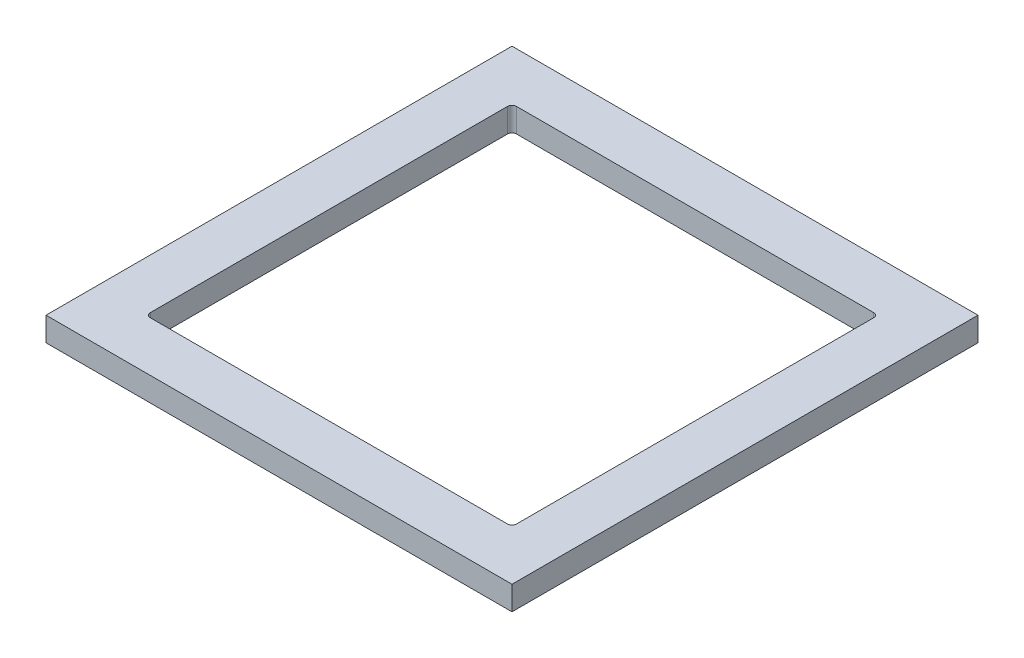
ISO-10303-21;
HEADER;
FILE_DESCRIPTION(('STEP AP214'),'2;1');
FILE_NAME('part.step','',(''),(''),'','','');
FILE_SCHEMA(('AUTOMOTIVE_DESIGN { 1 0 10303 214 1 1 1 1 }'));
ENDSEC;
DATA;
#1=APPLICATION_CONTEXT('core data for automotive mechanical design processes');
#2=APPLICATION_PROTOCOL_DEFINITION('international standard','automotive_design',2000,#1);
#3=PRODUCT_CONTEXT('',#1,'mechanical');
#4=PRODUCT('Part','Part','',(#3));
#5=PRODUCT_RELATED_PRODUCT_CATEGORY('part','',(#4));
#6=PRODUCT_DEFINITION_FORMATION('','',#4);
#7=PRODUCT_DEFINITION_CONTEXT('part definition',#1,'design');
#8=PRODUCT_DEFINITION('design','',#6,#7);
#9=PRODUCT_DEFINITION_SHAPE('','',#8);
#10=(LENGTH_UNIT() NAMED_UNIT(*) SI_UNIT(.MILLI.,.METRE.));
#11=(NAMED_UNIT(*) PLANE_ANGLE_UNIT() SI_UNIT($,.RADIAN.));
#12=(NAMED_UNIT(*) SI_UNIT($,.STERADIAN.) SOLID_ANGLE_UNIT());
#13=UNCERTAINTY_MEASURE_WITH_UNIT(LENGTH_MEASURE(1.E-05),#10,'distance_accuracy_value','');
#14=(GEOMETRIC_REPRESENTATION_CONTEXT(3) GLOBAL_UNCERTAINTY_ASSIGNED_CONTEXT((#13)) GLOBAL_UNIT_ASSIGNED_CONTEXT((#10,
#11,#12)) REPRESENTATION_CONTEXT('',''));
#15=CARTESIAN_POINT('',(0.,0.,0.));
#16=DIRECTION('',(0.,0.,1.));
#17=DIRECTION('',(1.,0.,0.));
#18=AXIS2_PLACEMENT_3D('',#15,#16,#17);
#19=CARTESIAN_POINT('',(177.8,18.25625,-177.8));
#20=DIRECTION('',(-1.,0.,0.));
#21=DIRECTION('',(0.,0.,1.));
#22=AXIS2_PLACEMENT_3D('',#19,#20,#21);
#23=PLANE('',#22);
#24=DIRECTION('',(0.,0.,-1.));
#25=VECTOR('',#24,1.);
#26=CARTESIAN_POINT('',(177.8,0.,-177.8));
#27=LINE('',#26,#25);
#28=CARTESIAN_POINT('',(177.8,0.,177.8));
#29=VERTEX_POINT('',#28);
#30=CARTESIAN_POINT('',(177.8,0.,-177.8));
#31=VERTEX_POINT('',#30);
#32=EDGE_CURVE('E146',#29,#31,#27,.T.);
#33=ORIENTED_EDGE('',*,*,#32,.T.);
#34=DIRECTION('',(0.,-1.,0.));
#35=VECTOR('',#34,1.);
#36=CARTESIAN_POINT('',(177.8,18.25625,-177.8));
#37=LINE('',#36,#35);
#38=CARTESIAN_POINT('',(177.8,18.25625,-177.8));
#39=VERTEX_POINT('',#38);
#40=EDGE_CURVE('E127',#39,#31,#37,.T.);
#41=ORIENTED_EDGE('',*,*,#40,.F.);
#42=DIRECTION('',(0.,0.,-1.));
#43=VECTOR('',#42,1.);
#44=CARTESIAN_POINT('',(177.8,18.25625,-177.8));
#45=LINE('',#44,#43);
#46=CARTESIAN_POINT('',(177.8,18.25625,177.8));
#47=VERTEX_POINT('',#46);
#48=EDGE_CURVE('E134',#47,#39,#45,.T.);
#49=ORIENTED_EDGE('',*,*,#48,.F.);
#50=DIRECTION('',(0.,-1.,0.));
#51=VECTOR('',#50,1.);
#52=CARTESIAN_POINT('',(177.8,18.25625,177.8));
#53=LINE('',#52,#51);
#54=EDGE_CURVE('E220',#47,#29,#53,.T.);
#55=ORIENTED_EDGE('',*,*,#54,.T.);
#56=EDGE_LOOP('',(#33,#41,#49,#55));
#57=FACE_BOUND('',#56,.T.);
#58=ADVANCED_FACE('F33',(#57),#23,.F.);
#59=CARTESIAN_POINT('',(-177.8,18.25625,-177.8));
#60=DIRECTION('',(0.,0.,1.));
#61=DIRECTION('',(1.,0.,0.));
#62=AXIS2_PLACEMENT_3D('',#59,#60,#61);
#63=PLANE('',#62);
#64=DIRECTION('',(-1.,0.,0.));
#65=VECTOR('',#64,1.);
#66=CARTESIAN_POINT('',(-177.8,0.,-177.8));
#67=LINE('',#66,#65);
#68=CARTESIAN_POINT('',(-177.8,0.,-177.8));
#69=VERTEX_POINT('',#68);
#70=EDGE_CURVE('E222',#31,#69,#67,.T.);
#71=ORIENTED_EDGE('',*,*,#70,.T.);
#72=DIRECTION('',(0.,-1.,0.));
#73=VECTOR('',#72,1.);
#74=CARTESIAN_POINT('',(-177.8,18.25625,-177.8));
#75=LINE('',#74,#73);
#76=CARTESIAN_POINT('',(-177.8,18.25625,-177.8));
#77=VERTEX_POINT('',#76);
#78=EDGE_CURVE('E130',#77,#69,#75,.T.);
#79=ORIENTED_EDGE('',*,*,#78,.F.);
#80=DIRECTION('',(-1.,0.,0.));
#81=VECTOR('',#80,1.);
#82=CARTESIAN_POINT('',(-177.8,18.25625,-177.8));
#83=LINE('',#82,#81);
#84=EDGE_CURVE('E123',#39,#77,#83,.T.);
#85=ORIENTED_EDGE('',*,*,#84,.F.);
#86=ORIENTED_EDGE('',*,*,#40,.T.);
#87=EDGE_LOOP('',(#71,#79,#85,#86));
#88=FACE_BOUND('',#87,.T.);
#89=ADVANCED_FACE('F125',(#88),#63,.F.);
#90=CARTESIAN_POINT('',(-177.8,18.25625,-177.8));
#91=DIRECTION('',(1.,0.,0.));
#92=DIRECTION('',(0.,0.,-1.));
#93=AXIS2_PLACEMENT_3D('',#90,#91,#92);
#94=PLANE('',#93);
#95=DIRECTION('',(0.,0.,1.));
#96=VECTOR('',#95,1.);
#97=CARTESIAN_POINT('',(-177.8,0.,-177.8));
#98=LINE('',#97,#96);
#99=CARTESIAN_POINT('',(-177.8,0.,177.8));
#100=VERTEX_POINT('',#99);
#101=EDGE_CURVE('E224',#69,#100,#98,.T.);
#102=ORIENTED_EDGE('',*,*,#101,.T.);
#103=DIRECTION('',(0.,-1.,0.));
#104=VECTOR('',#103,1.);
#105=CARTESIAN_POINT('',(-177.8,18.25625,177.8));
#106=LINE('',#105,#104);
#107=CARTESIAN_POINT('',(-177.8,18.25625,177.8));
#108=VERTEX_POINT('',#107);
#109=EDGE_CURVE('E151',#108,#100,#106,.T.);
#110=ORIENTED_EDGE('',*,*,#109,.F.);
#111=DIRECTION('',(0.,0.,1.));
#112=VECTOR('',#111,1.);
#113=CARTESIAN_POINT('',(-177.8,18.25625,-177.8));
#114=LINE('',#113,#112);
#115=EDGE_CURVE('E133',#77,#108,#114,.T.);
#116=ORIENTED_EDGE('',*,*,#115,.F.);
#117=ORIENTED_EDGE('',*,*,#78,.T.);
#118=EDGE_LOOP('',(#102,#110,#116,#117));
#119=FACE_BOUND('',#118,.T.);
#120=ADVANCED_FACE('F234',(#119),#94,.F.);
#121=CARTESIAN_POINT('',(-177.8,18.25625,177.8));
#122=DIRECTION('',(0.,0.,-1.));
#123=DIRECTION('',(-1.,0.,0.));
#124=AXIS2_PLACEMENT_3D('',#121,#122,#123);
#125=PLANE('',#124);
#126=DIRECTION('',(1.,0.,0.));
#127=VECTOR('',#126,1.);
#128=CARTESIAN_POINT('',(-177.8,0.,177.8));
#129=LINE('',#128,#127);
#130=EDGE_CURVE('E143',#100,#29,#129,.T.);
#131=ORIENTED_EDGE('',*,*,#130,.T.);
#132=ORIENTED_EDGE('',*,*,#54,.F.);
#133=DIRECTION('',(1.,0.,0.));
#134=VECTOR('',#133,1.);
#135=CARTESIAN_POINT('',(-177.8,18.25625,177.8));
#136=LINE('',#135,#134);
#137=EDGE_CURVE('E139',#108,#47,#136,.T.);
#138=ORIENTED_EDGE('',*,*,#137,.F.);
#139=ORIENTED_EDGE('',*,*,#109,.T.);
#140=EDGE_LOOP('',(#131,#132,#138,#139));
#141=FACE_BOUND('',#140,.T.);
#142=ADVANCED_FACE('F231',(#141),#125,.F.);
#143=CARTESIAN_POINT('',(0.,18.25625,0.));
#144=DIRECTION('',(0.,1.,0.));
#145=DIRECTION('',(0.,0.,1.));
#146=AXIS2_PLACEMENT_3D('',#143,#144,#145);
#147=PLANE('',#146);
#148=DIRECTION('',(0.,0.,1.));
#149=VECTOR('',#148,1.);
#150=CARTESIAN_POINT('',(-139.7,18.25625,-139.7));
#151=LINE('',#150,#149);
#152=CARTESIAN_POINT('',(-139.7,18.25625,-136.3218));
#153=VERTEX_POINT('',#152);
#154=CARTESIAN_POINT('',(-139.7,18.25625,136.3218));
#155=VERTEX_POINT('',#154);
#156=EDGE_CURVE('E184',#153,#155,#151,.T.);
#157=ORIENTED_EDGE('',*,*,#156,.F.);
#158=CARTESIAN_POINT('',(-136.3218,18.25625,-136.3218));
#159=DIRECTION('',(0.,1.,0.));
#160=DIRECTION('',(0.,0.,1.));
#161=AXIS2_PLACEMENT_3D('',#158,#159,#160);
#162=CIRCLE('',#161,3.3782);
#163=CARTESIAN_POINT('',(-136.3218,18.25625,-139.7));
#164=VERTEX_POINT('',#163);
#165=EDGE_CURVE('E179',#153,#164,#162,.F.);
#166=ORIENTED_EDGE('',*,*,#165,.T.);
#167=DIRECTION('',(-1.,0.,0.));
#168=VECTOR('',#167,1.);
#169=CARTESIAN_POINT('',(139.7,18.25625,-139.7));
#170=LINE('',#169,#168);
#171=CARTESIAN_POINT('',(136.3218,18.25625,-139.7));
#172=VERTEX_POINT('',#171);
#173=EDGE_CURVE('E208',#172,#164,#170,.T.);
#174=ORIENTED_EDGE('',*,*,#173,.F.);
#175=CARTESIAN_POINT('',(136.3218,18.25625,-136.3218));
#176=DIRECTION('',(0.,1.,0.));
#177=DIRECTION('',(0.,0.,1.));
#178=AXIS2_PLACEMENT_3D('',#175,#176,#177);
#179=CIRCLE('',#178,3.3782);
#180=CARTESIAN_POINT('',(139.7,18.25625,-136.3218));
#181=VERTEX_POINT('',#180);
#182=EDGE_CURVE('E171',#172,#181,#179,.F.);
#183=ORIENTED_EDGE('',*,*,#182,.T.);
#184=DIRECTION('',(0.,0.,-1.));
#185=VECTOR('',#184,1.);
#186=CARTESIAN_POINT('',(139.7,18.25625,-139.7));
#187=LINE('',#186,#185);
#188=CARTESIAN_POINT('',(139.7,18.25625,136.3218));
#189=VERTEX_POINT('',#188);
#190=EDGE_CURVE('E213',#189,#181,#187,.T.);
#191=ORIENTED_EDGE('',*,*,#190,.F.);
#192=CARTESIAN_POINT('',(136.3218,18.25625,136.3218));
#193=DIRECTION('',(0.,1.,0.));
#194=DIRECTION('',(0.,0.,1.));
#195=AXIS2_PLACEMENT_3D('',#192,#193,#194);
#196=CIRCLE('',#195,3.3782);
#197=CARTESIAN_POINT('',(136.3218,18.25625,139.7));
#198=VERTEX_POINT('',#197);
#199=EDGE_CURVE('E175',#189,#198,#196,.F.);
#200=ORIENTED_EDGE('',*,*,#199,.T.);
#201=DIRECTION('',(1.,0.,0.));
#202=VECTOR('',#201,1.);
#203=CARTESIAN_POINT('',(139.7,18.25625,139.7));
#204=LINE('',#203,#202);
#205=CARTESIAN_POINT('',(-136.3218,18.25625,139.7));
#206=VERTEX_POINT('',#205);
#207=EDGE_CURVE('E186',#206,#198,#204,.T.);
#208=ORIENTED_EDGE('',*,*,#207,.F.);
#209=CARTESIAN_POINT('',(-136.3218,18.25625,136.3218));
#210=DIRECTION('',(0.,1.,0.));
#211=DIRECTION('',(0.,0.,1.));
#212=AXIS2_PLACEMENT_3D('',#209,#210,#211);
#213=CIRCLE('',#212,3.3782);
#214=EDGE_CURVE('E41',#206,#155,#213,.F.);
#215=ORIENTED_EDGE('',*,*,#214,.T.);
#216=EDGE_LOOP('',(#157,#166,#174,#183,#191,#200,#208,#215));
#217=FACE_BOUND('',#216,.T.);
#218=ORIENTED_EDGE('',*,*,#48,.T.);
#219=ORIENTED_EDGE('',*,*,#84,.T.);
#220=ORIENTED_EDGE('',*,*,#115,.T.);
#221=ORIENTED_EDGE('',*,*,#137,.T.);
#222=EDGE_LOOP('',(#218,#219,#220,#221));
#223=FACE_BOUND('',#222,.T.);
#224=ADVANCED_FACE('F137',(#217,#223),#147,.T.);
#225=CARTESIAN_POINT('',(0.,0.,0.));
#226=DIRECTION('',(0.,1.,0.));
#227=DIRECTION('',(0.,0.,1.));
#228=AXIS2_PLACEMENT_3D('',#225,#226,#227);
#229=PLANE('',#228);
#230=DIRECTION('',(0.,0.,-1.));
#231=VECTOR('',#230,1.);
#232=CARTESIAN_POINT('',(139.7,0.,-139.7));
#233=LINE('',#232,#231);
#234=CARTESIAN_POINT('',(139.7,0.,136.3218));
#235=VERTEX_POINT('',#234);
#236=CARTESIAN_POINT('',(139.7,0.,-136.3218));
#237=VERTEX_POINT('',#236);
#238=EDGE_CURVE('E204',#235,#237,#233,.T.);
#239=ORIENTED_EDGE('',*,*,#238,.T.);
#240=CARTESIAN_POINT('',(136.3218,0.,-136.3218));
#241=DIRECTION('',(0.,1.,0.));
#242=DIRECTION('',(0.,0.,1.));
#243=AXIS2_PLACEMENT_3D('',#240,#241,#242);
#244=CIRCLE('',#243,3.3782);
#245=CARTESIAN_POINT('',(136.3218,0.,-139.7));
#246=VERTEX_POINT('',#245);
#247=EDGE_CURVE('E173',#237,#246,#244,.T.);
#248=ORIENTED_EDGE('',*,*,#247,.T.);
#249=DIRECTION('',(-1.,0.,0.));
#250=VECTOR('',#249,1.);
#251=CARTESIAN_POINT('',(139.7,0.,-139.7));
#252=LINE('',#251,#250);
#253=CARTESIAN_POINT('',(-136.3218,0.,-139.7));
#254=VERTEX_POINT('',#253);
#255=EDGE_CURVE('E206',#246,#254,#252,.T.);
#256=ORIENTED_EDGE('',*,*,#255,.T.);
#257=CARTESIAN_POINT('',(-136.3218,0.,-136.3218));
#258=DIRECTION('',(0.,1.,0.));
#259=DIRECTION('',(0.,0.,1.));
#260=AXIS2_PLACEMENT_3D('',#257,#258,#259);
#261=CIRCLE('',#260,3.3782);
#262=CARTESIAN_POINT('',(-139.7,0.,-136.3218));
#263=VERTEX_POINT('',#262);
#264=EDGE_CURVE('E55',#254,#263,#261,.T.);
#265=ORIENTED_EDGE('',*,*,#264,.T.);
#266=DIRECTION('',(0.,0.,1.));
#267=VECTOR('',#266,1.);
#268=CARTESIAN_POINT('',(-139.7,0.,-139.7));
#269=LINE('',#268,#267);
#270=CARTESIAN_POINT('',(-139.7,0.,136.3218));
#271=VERTEX_POINT('',#270);
#272=EDGE_CURVE('E200',#263,#271,#269,.T.);
#273=ORIENTED_EDGE('',*,*,#272,.T.);
#274=CARTESIAN_POINT('',(-136.3218,0.,136.3218));
#275=DIRECTION('',(0.,1.,0.));
#276=DIRECTION('',(0.,0.,1.));
#277=AXIS2_PLACEMENT_3D('',#274,#275,#276);
#278=CIRCLE('',#277,3.3782);
#279=CARTESIAN_POINT('',(-136.3218,0.,139.7));
#280=VERTEX_POINT('',#279);
#281=EDGE_CURVE('E11',#271,#280,#278,.T.);
#282=ORIENTED_EDGE('',*,*,#281,.T.);
#283=DIRECTION('',(1.,0.,0.));
#284=VECTOR('',#283,1.);
#285=CARTESIAN_POINT('',(139.7,0.,139.7));
#286=LINE('',#285,#284);
#287=CARTESIAN_POINT('',(136.3218,0.,139.7));
#288=VERTEX_POINT('',#287);
#289=EDGE_CURVE('E198',#280,#288,#286,.T.);
#290=ORIENTED_EDGE('',*,*,#289,.T.);
#291=CARTESIAN_POINT('',(136.3218,0.,136.3218));
#292=DIRECTION('',(0.,1.,0.));
#293=DIRECTION('',(0.,0.,1.));
#294=AXIS2_PLACEMENT_3D('',#291,#292,#293);
#295=CIRCLE('',#294,3.3782);
#296=EDGE_CURVE('E177',#288,#235,#295,.T.);
#297=ORIENTED_EDGE('',*,*,#296,.T.);
#298=EDGE_LOOP('',(#239,#248,#256,#265,#273,#282,#290,#297));
#299=FACE_BOUND('',#298,.T.);
#300=ORIENTED_EDGE('',*,*,#32,.F.);
#301=ORIENTED_EDGE('',*,*,#130,.F.);
#302=ORIENTED_EDGE('',*,*,#101,.F.);
#303=ORIENTED_EDGE('',*,*,#70,.F.);
#304=EDGE_LOOP('',(#300,#301,#302,#303));
#305=FACE_BOUND('',#304,.T.);
#306=ADVANCED_FACE('F196',(#299,#305),#229,.F.);
#307=CARTESIAN_POINT('',(-139.7,0.,-139.7));
#308=DIRECTION('',(-1.,0.,0.));
#309=DIRECTION('',(0.,0.,1.));
#310=AXIS2_PLACEMENT_3D('',#307,#308,#309);
#311=PLANE('',#310);
#312=ORIENTED_EDGE('',*,*,#272,.F.);
#313=DIRECTION('',(0.,1.,0.));
#314=VECTOR('',#313,1.);
#315=CARTESIAN_POINT('',(-139.7,18.25625,-136.3218));
#316=LINE('',#315,#314);
#317=EDGE_CURVE('E168',#263,#153,#316,.T.);
#318=ORIENTED_EDGE('',*,*,#317,.T.);
#319=ORIENTED_EDGE('',*,*,#156,.T.);
#320=DIRECTION('',(0.,1.,0.));
#321=VECTOR('',#320,1.);
#322=CARTESIAN_POINT('',(-139.7,0.,136.3218));
#323=LINE('',#322,#321);
#324=EDGE_CURVE('E48',#155,#271,#323,.F.);
#325=ORIENTED_EDGE('',*,*,#324,.T.);
#326=EDGE_LOOP('',(#312,#318,#319,#325));
#327=FACE_BOUND('',#326,.T.);
#328=ADVANCED_FACE('F189',(#327),#311,.F.);
#329=CARTESIAN_POINT('',(139.7,0.,-139.7));
#330=DIRECTION('',(0.,0.,-1.));
#331=DIRECTION('',(-1.,0.,0.));
#332=AXIS2_PLACEMENT_3D('',#329,#330,#331);
#333=PLANE('',#332);
#334=ORIENTED_EDGE('',*,*,#255,.F.);
#335=DIRECTION('',(0.,1.,0.));
#336=VECTOR('',#335,1.);
#337=CARTESIAN_POINT('',(136.3218,18.25625,-139.7));
#338=LINE('',#337,#336);
#339=EDGE_CURVE('E149',#246,#172,#338,.T.);
#340=ORIENTED_EDGE('',*,*,#339,.T.);
#341=ORIENTED_EDGE('',*,*,#173,.T.);
#342=DIRECTION('',(0.,1.,0.));
#343=VECTOR('',#342,1.);
#344=CARTESIAN_POINT('',(-136.3218,0.,-139.7));
#345=LINE('',#344,#343);
#346=EDGE_CURVE('E147',#164,#254,#345,.F.);
#347=ORIENTED_EDGE('',*,*,#346,.T.);
#348=EDGE_LOOP('',(#334,#340,#341,#347));
#349=FACE_BOUND('',#348,.T.);
#350=ADVANCED_FACE('F265',(#349),#333,.F.);
#351=CARTESIAN_POINT('',(139.7,0.,-139.7));
#352=DIRECTION('',(1.,0.,0.));
#353=DIRECTION('',(0.,0.,-1.));
#354=AXIS2_PLACEMENT_3D('',#351,#352,#353);
#355=PLANE('',#354);
#356=ORIENTED_EDGE('',*,*,#190,.T.);
#357=DIRECTION('',(0.,1.,0.));
#358=VECTOR('',#357,1.);
#359=CARTESIAN_POINT('',(139.7,0.,-136.3218));
#360=LINE('',#359,#358);
#361=EDGE_CURVE('E160',#181,#237,#360,.F.);
#362=ORIENTED_EDGE('',*,*,#361,.T.);
#363=ORIENTED_EDGE('',*,*,#238,.F.);
#364=DIRECTION('',(0.,1.,0.));
#365=VECTOR('',#364,1.);
#366=CARTESIAN_POINT('',(139.7,18.25625,136.3218));
#367=LINE('',#366,#365);
#368=EDGE_CURVE('E157',#235,#189,#367,.T.);
#369=ORIENTED_EDGE('',*,*,#368,.T.);
#370=EDGE_LOOP('',(#356,#362,#363,#369));
#371=FACE_BOUND('',#370,.T.);
#372=ADVANCED_FACE('F271',(#371),#355,.F.);
#373=CARTESIAN_POINT('',(139.7,0.,139.7));
#374=DIRECTION('',(0.,0.,1.));
#375=DIRECTION('',(1.,0.,0.));
#376=AXIS2_PLACEMENT_3D('',#373,#374,#375);
#377=PLANE('',#376);
#378=ORIENTED_EDGE('',*,*,#207,.T.);
#379=DIRECTION('',(0.,1.,0.));
#380=VECTOR('',#379,1.);
#381=CARTESIAN_POINT('',(136.3218,0.,139.7));
#382=LINE('',#381,#380);
#383=EDGE_CURVE('E165',#198,#288,#382,.F.);
#384=ORIENTED_EDGE('',*,*,#383,.T.);
#385=ORIENTED_EDGE('',*,*,#289,.F.);
#386=DIRECTION('',(0.,1.,0.));
#387=VECTOR('',#386,1.);
#388=CARTESIAN_POINT('',(-136.3218,18.25625,139.7));
#389=LINE('',#388,#387);
#390=EDGE_CURVE('E162',#280,#206,#389,.T.);
#391=ORIENTED_EDGE('',*,*,#390,.T.);
#392=EDGE_LOOP('',(#378,#384,#385,#391));
#393=FACE_BOUND('',#392,.T.);
#394=ADVANCED_FACE('F202',(#393),#377,.F.);
#395=CARTESIAN_POINT('',(136.3218,0.,-136.3218));
#396=DIRECTION('',(0.,-1.,0.));
#397=DIRECTION('',(0.,0.,-1.));
#398=AXIS2_PLACEMENT_3D('',#395,#396,#397);
#399=CYLINDRICAL_SURFACE('',#398,3.3782);
#400=ORIENTED_EDGE('',*,*,#247,.F.);
#401=ORIENTED_EDGE('',*,*,#361,.F.);
#402=ORIENTED_EDGE('',*,*,#182,.F.);
#403=ORIENTED_EDGE('',*,*,#339,.F.);
#404=EDGE_LOOP('',(#400,#401,#402,#403));
#405=FACE_BOUND('',#404,.T.);
#406=ADVANCED_FACE('F248',(#405),#399,.F.);
#407=CARTESIAN_POINT('',(136.3218,0.,136.3218));
#408=DIRECTION('',(0.,-1.,0.));
#409=DIRECTION('',(0.,0.,-1.));
#410=AXIS2_PLACEMENT_3D('',#407,#408,#409);
#411=CYLINDRICAL_SURFACE('',#410,3.3782);
#412=ORIENTED_EDGE('',*,*,#296,.F.);
#413=ORIENTED_EDGE('',*,*,#383,.F.);
#414=ORIENTED_EDGE('',*,*,#199,.F.);
#415=ORIENTED_EDGE('',*,*,#368,.F.);
#416=EDGE_LOOP('',(#412,#413,#414,#415));
#417=FACE_BOUND('',#416,.T.);
#418=ADVANCED_FACE('F251',(#417),#411,.F.);
#419=CARTESIAN_POINT('',(-136.3218,0.,-136.3218));
#420=DIRECTION('',(0.,-1.,0.));
#421=DIRECTION('',(0.,0.,-1.));
#422=AXIS2_PLACEMENT_3D('',#419,#420,#421);
#423=CYLINDRICAL_SURFACE('',#422,3.3782);
#424=ORIENTED_EDGE('',*,*,#264,.F.);
#425=ORIENTED_EDGE('',*,*,#346,.F.);
#426=ORIENTED_EDGE('',*,*,#165,.F.);
#427=ORIENTED_EDGE('',*,*,#317,.F.);
#428=EDGE_LOOP('',(#424,#425,#426,#427));
#429=FACE_BOUND('',#428,.T.);
#430=ADVANCED_FACE('F254',(#429),#423,.F.);
#431=CARTESIAN_POINT('',(-136.3218,0.,136.3218));
#432=DIRECTION('',(0.,-1.,0.));
#433=DIRECTION('',(0.,0.,-1.));
#434=AXIS2_PLACEMENT_3D('',#431,#432,#433);
#435=CYLINDRICAL_SURFACE('',#434,3.3782);
#436=ORIENTED_EDGE('',*,*,#281,.F.);
#437=ORIENTED_EDGE('',*,*,#324,.F.);
#438=ORIENTED_EDGE('',*,*,#214,.F.);
#439=ORIENTED_EDGE('',*,*,#390,.F.);
#440=EDGE_LOOP('',(#436,#437,#438,#439));
#441=FACE_BOUND('',#440,.T.);
#442=ADVANCED_FACE('F35',(#441),#435,.F.);
#443=CLOSED_SHELL('',(#58,#89,#120,#142,#224,#306,#328,#350,#372,#394,#406,#418,#430,#442));
#444=MANIFOLD_SOLID_BREP('B2',#443);
#445=ADVANCED_BREP_SHAPE_REPRESENTATION('',(#18,#444),#14);
#446=SHAPE_DEFINITION_REPRESENTATION(#9,#445);
ENDSEC;
END-ISO-10303-21;
